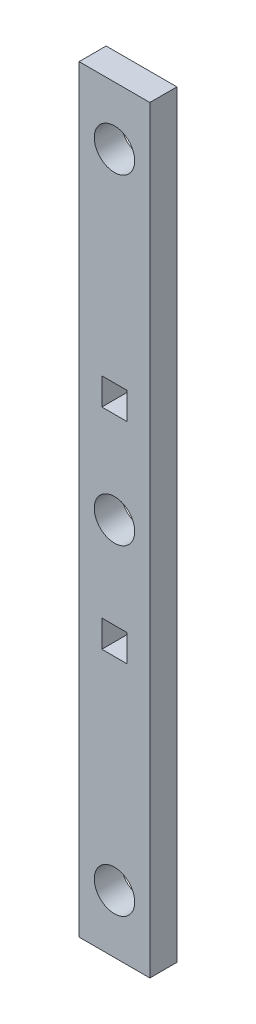
ISO-10303-21;
HEADER;
FILE_DESCRIPTION(('STEP AP214'),'2;1');
FILE_NAME('part.step','',(''),(''),'','','');
FILE_SCHEMA(('AUTOMOTIVE_DESIGN { 1 0 10303 214 1 1 1 1 }'));
ENDSEC;
DATA;
#1=APPLICATION_CONTEXT('core data for automotive mechanical design processes');
#2=APPLICATION_PROTOCOL_DEFINITION('international standard','automotive_design',2000,#1);
#3=PRODUCT_CONTEXT('',#1,'mechanical');
#4=PRODUCT('Part','Part','',(#3));
#5=PRODUCT_RELATED_PRODUCT_CATEGORY('part','',(#4));
#6=PRODUCT_DEFINITION_FORMATION('','',#4);
#7=PRODUCT_DEFINITION_CONTEXT('part definition',#1,'design');
#8=PRODUCT_DEFINITION('design','',#6,#7);
#9=PRODUCT_DEFINITION_SHAPE('','',#8);
#10=(LENGTH_UNIT() NAMED_UNIT(*) SI_UNIT(.MILLI.,.METRE.));
#11=(NAMED_UNIT(*) PLANE_ANGLE_UNIT() SI_UNIT($,.RADIAN.));
#12=(NAMED_UNIT(*) SI_UNIT($,.STERADIAN.) SOLID_ANGLE_UNIT());
#13=UNCERTAINTY_MEASURE_WITH_UNIT(LENGTH_MEASURE(1.E-05),#10,'distance_accuracy_value','');
#14=(GEOMETRIC_REPRESENTATION_CONTEXT(3) GLOBAL_UNCERTAINTY_ASSIGNED_CONTEXT((#13)) GLOBAL_UNIT_ASSIGNED_CONTEXT((#10,
#11,#12)) REPRESENTATION_CONTEXT('',''));
#15=CARTESIAN_POINT('',(0.,0.,0.));
#16=DIRECTION('',(0.,0.,1.));
#17=DIRECTION('',(1.,0.,0.));
#18=AXIS2_PLACEMENT_3D('',#15,#16,#17);
#19=CARTESIAN_POINT('',(0.,0.,5.35));
#20=DIRECTION('',(0.,0.,-1.));
#21=DIRECTION('',(-1.,0.,0.));
#22=AXIS2_PLACEMENT_3D('',#19,#20,#21);
#23=PLANE('',#22);
#24=CARTESIAN_POINT('',(7.,11.5,5.35));
#25=DIRECTION('',(0.,0.,1.));
#26=DIRECTION('',(-1.,0.,0.));
#27=AXIS2_PLACEMENT_3D('',#24,#25,#26);
#28=CIRCLE('',#27,4.);
#29=CARTESIAN_POINT('',(3.,11.5,5.35));
#30=VERTEX_POINT('',#29);
#31=EDGE_CURVE('E157',#30,#30,#28,.T.);
#32=ORIENTED_EDGE('',*,*,#31,.F.);
#33=EDGE_LOOP('',(#32));
#34=FACE_BOUND('',#33,.T.);
#35=DIRECTION('',(0.,1.,0.));
#36=VECTOR('',#35,1.);
#37=CARTESIAN_POINT('',(9.50000000000001,98.425,5.35));
#38=LINE('',#37,#36);
#39=CARTESIAN_POINT('',(9.50000000000001,93.075,5.35));
#40=VERTEX_POINT('',#39);
#41=CARTESIAN_POINT('',(9.50000000000001,98.425,5.35));
#42=VERTEX_POINT('',#41);
#43=EDGE_CURVE('E163',#40,#42,#38,.T.);
#44=ORIENTED_EDGE('',*,*,#43,.F.);
#45=DIRECTION('',(1.,0.,0.));
#46=VECTOR('',#45,1.);
#47=CARTESIAN_POINT('',(4.50000000000001,93.075,5.35));
#48=LINE('',#47,#46);
#49=CARTESIAN_POINT('',(4.50000000000001,93.075,5.35));
#50=VERTEX_POINT('',#49);
#51=EDGE_CURVE('E171',#50,#40,#48,.T.);
#52=ORIENTED_EDGE('',*,*,#51,.F.);
#53=DIRECTION('',(0.,-1.,0.));
#54=VECTOR('',#53,1.);
#55=CARTESIAN_POINT('',(4.50000000000001,98.425,5.35));
#56=LINE('',#55,#54);
#57=CARTESIAN_POINT('',(4.50000000000001,98.425,5.35));
#58=VERTEX_POINT('',#57);
#59=EDGE_CURVE('E168',#58,#50,#56,.T.);
#60=ORIENTED_EDGE('',*,*,#59,.F.);
#61=DIRECTION('',(-1.,0.,0.));
#62=VECTOR('',#61,1.);
#63=CARTESIAN_POINT('',(4.50000000000001,98.425,5.35));
#64=LINE('',#63,#62);
#65=EDGE_CURVE('E165',#42,#58,#64,.T.);
#66=ORIENTED_EDGE('',*,*,#65,.F.);
#67=EDGE_LOOP('',(#44,#52,#60,#66));
#68=FACE_BOUND('',#67,.T.);
#69=DIRECTION('',(0.,-1.,0.));
#70=VECTOR('',#69,1.);
#71=CARTESIAN_POINT('',(0.,0.,5.35));
#72=LINE('',#71,#70);
#73=CARTESIAN_POINT('',(0.,150.,5.35));
#74=VERTEX_POINT('',#73);
#75=CARTESIAN_POINT('',(0.,0.,5.35));
#76=VERTEX_POINT('',#75);
#77=EDGE_CURVE('E206',#74,#76,#72,.T.);
#78=ORIENTED_EDGE('',*,*,#77,.T.);
#79=DIRECTION('',(1.,0.,0.));
#80=VECTOR('',#79,1.);
#81=CARTESIAN_POINT('',(0.,0.,5.35));
#82=LINE('',#81,#80);
#83=CARTESIAN_POINT('',(14.,0.,5.35));
#84=VERTEX_POINT('',#83);
#85=EDGE_CURVE('E209',#76,#84,#82,.T.);
#86=ORIENTED_EDGE('',*,*,#85,.T.);
#87=DIRECTION('',(0.,1.,0.));
#88=VECTOR('',#87,1.);
#89=CARTESIAN_POINT('',(14.,0.,5.35));
#90=LINE('',#89,#88);
#91=CARTESIAN_POINT('',(14.,150.,5.35));
#92=VERTEX_POINT('',#91);
#93=EDGE_CURVE('E212',#84,#92,#90,.T.);
#94=ORIENTED_EDGE('',*,*,#93,.T.);
#95=DIRECTION('',(-1.,0.,0.));
#96=VECTOR('',#95,1.);
#97=CARTESIAN_POINT('',(0.,150.,5.35));
#98=LINE('',#97,#96);
#99=EDGE_CURVE('E214',#92,#74,#98,.T.);
#100=ORIENTED_EDGE('',*,*,#99,.T.);
#101=EDGE_LOOP('',(#78,#86,#94,#100));
#102=FACE_BOUND('',#101,.T.);
#103=CARTESIAN_POINT('',(7.,138.5,5.35));
#104=DIRECTION('',(0.,0.,1.));
#105=DIRECTION('',(1.,0.,0.));
#106=AXIS2_PLACEMENT_3D('',#103,#104,#105);
#107=CIRCLE('',#106,4.);
#108=CARTESIAN_POINT('',(11.,138.5,5.35));
#109=VERTEX_POINT('',#108);
#110=EDGE_CURVE('E200',#109,#109,#107,.T.);
#111=ORIENTED_EDGE('',*,*,#110,.F.);
#112=EDGE_LOOP('',(#111));
#113=FACE_BOUND('',#112,.T.);
#114=CARTESIAN_POINT('',(7.,75.,5.35));
#115=DIRECTION('',(0.,0.,1.));
#116=DIRECTION('',(1.,0.,0.));
#117=AXIS2_PLACEMENT_3D('',#114,#115,#116);
#118=CIRCLE('',#117,4.);
#119=CARTESIAN_POINT('',(11.,75.,5.35));
#120=VERTEX_POINT('',#119);
#121=EDGE_CURVE('E194',#120,#120,#118,.T.);
#122=ORIENTED_EDGE('',*,*,#121,.F.);
#123=EDGE_LOOP('',(#122));
#124=FACE_BOUND('',#123,.T.);
#125=DIRECTION('',(0.,-1.,0.));
#126=VECTOR('',#125,1.);
#127=CARTESIAN_POINT('',(4.50000000000001,51.575,5.35));
#128=LINE('',#127,#126);
#129=CARTESIAN_POINT('',(4.50000000000001,56.925,5.35));
#130=VERTEX_POINT('',#129);
#131=CARTESIAN_POINT('',(4.50000000000001,51.575,5.35));
#132=VERTEX_POINT('',#131);
#133=EDGE_CURVE('E121',#130,#132,#128,.T.);
#134=ORIENTED_EDGE('',*,*,#133,.F.);
#135=DIRECTION('',(-1.,0.,0.));
#136=VECTOR('',#135,1.);
#137=CARTESIAN_POINT('',(4.50000000000001,56.925,5.35));
#138=LINE('',#137,#136);
#139=CARTESIAN_POINT('',(9.50000000000001,56.925,5.35));
#140=VERTEX_POINT('',#139);
#141=EDGE_CURVE('E143',#140,#130,#138,.T.);
#142=ORIENTED_EDGE('',*,*,#141,.F.);
#143=DIRECTION('',(0.,1.,0.));
#144=VECTOR('',#143,1.);
#145=CARTESIAN_POINT('',(9.50000000000001,51.575,5.35));
#146=LINE('',#145,#144);
#147=CARTESIAN_POINT('',(9.50000000000001,51.575,5.35));
#148=VERTEX_POINT('',#147);
#149=EDGE_CURVE('E141',#148,#140,#146,.T.);
#150=ORIENTED_EDGE('',*,*,#149,.F.);
#151=DIRECTION('',(1.,0.,0.));
#152=VECTOR('',#151,1.);
#153=CARTESIAN_POINT('',(4.50000000000001,51.575,5.35));
#154=LINE('',#153,#152);
#155=EDGE_CURVE('E129',#132,#148,#154,.T.);
#156=ORIENTED_EDGE('',*,*,#155,.F.);
#157=EDGE_LOOP('',(#134,#142,#150,#156));
#158=FACE_BOUND('',#157,.T.);
#159=ADVANCED_FACE('F32',(#34,#68,#102,#113,#124,#158),#23,.F.);
#160=CARTESIAN_POINT('',(0.,0.,0.));
#161=DIRECTION('',(0.,0.,-1.));
#162=DIRECTION('',(-1.,0.,0.));
#163=AXIS2_PLACEMENT_3D('',#160,#161,#162);
#164=PLANE('',#163);
#165=DIRECTION('',(1.,0.,0.));
#166=VECTOR('',#165,1.);
#167=CARTESIAN_POINT('',(4.50000000000001,93.075,0.));
#168=LINE('',#167,#166);
#169=CARTESIAN_POINT('',(4.50000000000001,93.075,0.));
#170=VERTEX_POINT('',#169);
#171=CARTESIAN_POINT('',(9.50000000000001,93.075,0.));
#172=VERTEX_POINT('',#171);
#173=EDGE_CURVE('E166',#170,#172,#168,.T.);
#174=ORIENTED_EDGE('',*,*,#173,.T.);
#175=DIRECTION('',(0.,1.,0.));
#176=VECTOR('',#175,1.);
#177=CARTESIAN_POINT('',(9.50000000000001,98.425,0.));
#178=LINE('',#177,#176);
#179=CARTESIAN_POINT('',(9.50000000000001,98.425,0.));
#180=VERTEX_POINT('',#179);
#181=EDGE_CURVE('E160',#172,#180,#178,.T.);
#182=ORIENTED_EDGE('',*,*,#181,.T.);
#183=DIRECTION('',(-1.,0.,0.));
#184=VECTOR('',#183,1.);
#185=CARTESIAN_POINT('',(4.50000000000001,98.425,0.));
#186=LINE('',#185,#184);
#187=CARTESIAN_POINT('',(4.50000000000001,98.425,0.));
#188=VERTEX_POINT('',#187);
#189=EDGE_CURVE('E176',#180,#188,#186,.T.);
#190=ORIENTED_EDGE('',*,*,#189,.T.);
#191=DIRECTION('',(0.,-1.,0.));
#192=VECTOR('',#191,1.);
#193=CARTESIAN_POINT('',(4.50000000000001,98.425,0.));
#194=LINE('',#193,#192);
#195=EDGE_CURVE('E179',#188,#170,#194,.T.);
#196=ORIENTED_EDGE('',*,*,#195,.T.);
#197=EDGE_LOOP('',(#174,#182,#190,#196));
#198=FACE_BOUND('',#197,.T.);
#199=CARTESIAN_POINT('',(7.,75.,0.));
#200=DIRECTION('',(0.,0.,1.));
#201=DIRECTION('',(1.,0.,0.));
#202=AXIS2_PLACEMENT_3D('',#199,#200,#201);
#203=CIRCLE('',#202,4.);
#204=CARTESIAN_POINT('',(11.,75.,0.));
#205=VERTEX_POINT('',#204);
#206=EDGE_CURVE('E193',#205,#205,#203,.T.);
#207=ORIENTED_EDGE('',*,*,#206,.T.);
#208=EDGE_LOOP('',(#207));
#209=FACE_BOUND('',#208,.T.);
#210=DIRECTION('',(0.,-1.,0.));
#211=VECTOR('',#210,1.);
#212=CARTESIAN_POINT('',(0.,0.,0.));
#213=LINE('',#212,#211);
#214=CARTESIAN_POINT('',(0.,150.,0.));
#215=VERTEX_POINT('',#214);
#216=CARTESIAN_POINT('',(0.,0.,0.));
#217=VERTEX_POINT('',#216);
#218=EDGE_CURVE('E203',#215,#217,#213,.T.);
#219=ORIENTED_EDGE('',*,*,#218,.F.);
#220=DIRECTION('',(-1.,0.,0.));
#221=VECTOR('',#220,1.);
#222=CARTESIAN_POINT('',(0.,150.,0.));
#223=LINE('',#222,#221);
#224=CARTESIAN_POINT('',(14.,150.,0.));
#225=VERTEX_POINT('',#224);
#226=EDGE_CURVE('E210',#225,#215,#223,.T.);
#227=ORIENTED_EDGE('',*,*,#226,.F.);
#228=DIRECTION('',(0.,1.,0.));
#229=VECTOR('',#228,1.);
#230=CARTESIAN_POINT('',(14.,0.,0.));
#231=LINE('',#230,#229);
#232=CARTESIAN_POINT('',(14.,0.,0.));
#233=VERTEX_POINT('',#232);
#234=EDGE_CURVE('E221',#233,#225,#231,.T.);
#235=ORIENTED_EDGE('',*,*,#234,.F.);
#236=DIRECTION('',(1.,0.,0.));
#237=VECTOR('',#236,1.);
#238=CARTESIAN_POINT('',(0.,0.,0.));
#239=LINE('',#238,#237);
#240=EDGE_CURVE('E219',#217,#233,#239,.T.);
#241=ORIENTED_EDGE('',*,*,#240,.F.);
#242=EDGE_LOOP('',(#219,#227,#235,#241));
#243=FACE_BOUND('',#242,.T.);
#244=CARTESIAN_POINT('',(7.,138.5,0.));
#245=DIRECTION('',(0.,0.,1.));
#246=DIRECTION('',(1.,0.,0.));
#247=AXIS2_PLACEMENT_3D('',#244,#245,#246);
#248=CIRCLE('',#247,4.);
#249=CARTESIAN_POINT('',(11.,138.5,0.));
#250=VERTEX_POINT('',#249);
#251=EDGE_CURVE('E197',#250,#250,#248,.T.);
#252=ORIENTED_EDGE('',*,*,#251,.T.);
#253=EDGE_LOOP('',(#252));
#254=FACE_BOUND('',#253,.T.);
#255=CARTESIAN_POINT('',(7.,11.5,0.));
#256=DIRECTION('',(0.,0.,1.));
#257=DIRECTION('',(-1.,0.,0.));
#258=AXIS2_PLACEMENT_3D('',#255,#256,#257);
#259=CIRCLE('',#258,4.);
#260=CARTESIAN_POINT('',(3.,11.5,0.));
#261=VERTEX_POINT('',#260);
#262=EDGE_CURVE('E137',#261,#261,#259,.T.);
#263=ORIENTED_EDGE('',*,*,#262,.T.);
#264=EDGE_LOOP('',(#263));
#265=FACE_BOUND('',#264,.T.);
#266=DIRECTION('',(-1.,0.,0.));
#267=VECTOR('',#266,1.);
#268=CARTESIAN_POINT('',(4.50000000000001,56.925,0.));
#269=LINE('',#268,#267);
#270=CARTESIAN_POINT('',(9.50000000000001,56.925,0.));
#271=VERTEX_POINT('',#270);
#272=CARTESIAN_POINT('',(4.50000000000001,56.925,0.));
#273=VERTEX_POINT('',#272);
#274=EDGE_CURVE('E130',#271,#273,#269,.T.);
#275=ORIENTED_EDGE('',*,*,#274,.T.);
#276=DIRECTION('',(0.,-1.,0.));
#277=VECTOR('',#276,1.);
#278=CARTESIAN_POINT('',(4.50000000000001,51.575,0.));
#279=LINE('',#278,#277);
#280=CARTESIAN_POINT('',(4.50000000000001,51.575,0.));
#281=VERTEX_POINT('',#280);
#282=EDGE_CURVE('E55',#273,#281,#279,.T.);
#283=ORIENTED_EDGE('',*,*,#282,.T.);
#284=DIRECTION('',(1.,0.,0.));
#285=VECTOR('',#284,1.);
#286=CARTESIAN_POINT('',(4.50000000000001,51.575,0.));
#287=LINE('',#286,#285);
#288=CARTESIAN_POINT('',(9.50000000000001,51.575,0.));
#289=VERTEX_POINT('',#288);
#290=EDGE_CURVE('E136',#281,#289,#287,.T.);
#291=ORIENTED_EDGE('',*,*,#290,.T.);
#292=DIRECTION('',(0.,1.,0.));
#293=VECTOR('',#292,1.);
#294=CARTESIAN_POINT('',(9.50000000000001,51.575,0.));
#295=LINE('',#294,#293);
#296=EDGE_CURVE('E149',#289,#271,#295,.T.);
#297=ORIENTED_EDGE('',*,*,#296,.T.);
#298=EDGE_LOOP('',(#275,#283,#291,#297));
#299=FACE_BOUND('',#298,.T.);
#300=ADVANCED_FACE('F239',(#198,#209,#243,#254,#265,#299),#164,.T.);
#301=CARTESIAN_POINT('',(0.,0.,5.35));
#302=DIRECTION('',(1.,0.,0.));
#303=DIRECTION('',(0.,0.,-1.));
#304=AXIS2_PLACEMENT_3D('',#301,#302,#303);
#305=PLANE('',#304);
#306=ORIENTED_EDGE('',*,*,#218,.T.);
#307=DIRECTION('',(0.,0.,-1.));
#308=VECTOR('',#307,1.);
#309=CARTESIAN_POINT('',(0.,0.,5.35));
#310=LINE('',#309,#308);
#311=EDGE_CURVE('E11',#76,#217,#310,.T.);
#312=ORIENTED_EDGE('',*,*,#311,.F.);
#313=ORIENTED_EDGE('',*,*,#77,.F.);
#314=DIRECTION('',(0.,0.,-1.));
#315=VECTOR('',#314,1.);
#316=CARTESIAN_POINT('',(0.,150.,5.35));
#317=LINE('',#316,#315);
#318=EDGE_CURVE('E216',#74,#215,#317,.T.);
#319=ORIENTED_EDGE('',*,*,#318,.T.);
#320=EDGE_LOOP('',(#306,#312,#313,#319));
#321=FACE_BOUND('',#320,.T.);
#322=ADVANCED_FACE('F34',(#321),#305,.F.);
#323=CARTESIAN_POINT('',(0.,0.,5.35));
#324=DIRECTION('',(0.,1.,0.));
#325=DIRECTION('',(0.,0.,1.));
#326=AXIS2_PLACEMENT_3D('',#323,#324,#325);
#327=PLANE('',#326);
#328=ORIENTED_EDGE('',*,*,#240,.T.);
#329=DIRECTION('',(0.,0.,-1.));
#330=VECTOR('',#329,1.);
#331=CARTESIAN_POINT('',(14.,0.,5.35));
#332=LINE('',#331,#330);
#333=EDGE_CURVE('E40',#84,#233,#332,.T.);
#334=ORIENTED_EDGE('',*,*,#333,.F.);
#335=ORIENTED_EDGE('',*,*,#85,.F.);
#336=ORIENTED_EDGE('',*,*,#311,.T.);
#337=EDGE_LOOP('',(#328,#334,#335,#336));
#338=FACE_BOUND('',#337,.T.);
#339=ADVANCED_FACE('F250',(#338),#327,.F.);
#340=CARTESIAN_POINT('',(14.,0.,5.35));
#341=DIRECTION('',(-1.,0.,0.));
#342=DIRECTION('',(0.,0.,1.));
#343=AXIS2_PLACEMENT_3D('',#340,#341,#342);
#344=PLANE('',#343);
#345=ORIENTED_EDGE('',*,*,#234,.T.);
#346=DIRECTION('',(0.,0.,-1.));
#347=VECTOR('',#346,1.);
#348=CARTESIAN_POINT('',(14.,150.,5.35));
#349=LINE('',#348,#347);
#350=EDGE_CURVE('E226',#92,#225,#349,.T.);
#351=ORIENTED_EDGE('',*,*,#350,.F.);
#352=ORIENTED_EDGE('',*,*,#93,.F.);
#353=ORIENTED_EDGE('',*,*,#333,.T.);
#354=EDGE_LOOP('',(#345,#351,#352,#353));
#355=FACE_BOUND('',#354,.T.);
#356=ADVANCED_FACE('F233',(#355),#344,.F.);
#357=CARTESIAN_POINT('',(0.,150.,5.35));
#358=DIRECTION('',(0.,-1.,0.));
#359=DIRECTION('',(0.,0.,-1.));
#360=AXIS2_PLACEMENT_3D('',#357,#358,#359);
#361=PLANE('',#360);
#362=ORIENTED_EDGE('',*,*,#226,.T.);
#363=ORIENTED_EDGE('',*,*,#318,.F.);
#364=ORIENTED_EDGE('',*,*,#99,.F.);
#365=ORIENTED_EDGE('',*,*,#350,.T.);
#366=EDGE_LOOP('',(#362,#363,#364,#365));
#367=FACE_BOUND('',#366,.T.);
#368=ADVANCED_FACE('F243',(#367),#361,.F.);
#369=CARTESIAN_POINT('',(7.,138.5,5.35));
#370=DIRECTION('',(0.,0.,-1.));
#371=DIRECTION('',(-1.,0.,0.));
#372=AXIS2_PLACEMENT_3D('',#369,#370,#371);
#373=CYLINDRICAL_SURFACE('',#372,4.);
#374=ORIENTED_EDGE('',*,*,#110,.T.);
#375=EDGE_LOOP('',(#374));
#376=FACE_BOUND('',#375,.T.);
#377=ORIENTED_EDGE('',*,*,#251,.F.);
#378=EDGE_LOOP('',(#377));
#379=FACE_BOUND('',#378,.T.);
#380=ADVANCED_FACE('F268',(#376,#379),#373,.F.);
#381=CARTESIAN_POINT('',(7.,75.,5.35));
#382=DIRECTION('',(0.,0.,-1.));
#383=DIRECTION('',(-1.,0.,0.));
#384=AXIS2_PLACEMENT_3D('',#381,#382,#383);
#385=CYLINDRICAL_SURFACE('',#384,4.);
#386=ORIENTED_EDGE('',*,*,#121,.T.);
#387=EDGE_LOOP('',(#386));
#388=FACE_BOUND('',#387,.T.);
#389=ORIENTED_EDGE('',*,*,#206,.F.);
#390=EDGE_LOOP('',(#389));
#391=FACE_BOUND('',#390,.T.);
#392=ADVANCED_FACE('F275',(#388,#391),#385,.F.);
#393=CARTESIAN_POINT('',(9.50000000000001,98.425,5.35));
#394=DIRECTION('',(-1.,0.,0.));
#395=DIRECTION('',(0.,-1.,0.));
#396=AXIS2_PLACEMENT_3D('',#393,#394,#395);
#397=PLANE('',#396);
#398=ORIENTED_EDGE('',*,*,#181,.F.);
#399=DIRECTION('',(0.,0.,-1.));
#400=VECTOR('',#399,1.);
#401=CARTESIAN_POINT('',(9.50000000000001,93.075,5.35));
#402=LINE('',#401,#400);
#403=EDGE_CURVE('E173',#40,#172,#402,.T.);
#404=ORIENTED_EDGE('',*,*,#403,.F.);
#405=ORIENTED_EDGE('',*,*,#43,.T.);
#406=DIRECTION('',(0.,0.,-1.));
#407=VECTOR('',#406,1.);
#408=CARTESIAN_POINT('',(9.50000000000001,98.425,5.35));
#409=LINE('',#408,#407);
#410=EDGE_CURVE('E190',#42,#180,#409,.T.);
#411=ORIENTED_EDGE('',*,*,#410,.T.);
#412=EDGE_LOOP('',(#398,#404,#405,#411));
#413=FACE_BOUND('',#412,.T.);
#414=ADVANCED_FACE('F280',(#413),#397,.T.);
#415=CARTESIAN_POINT('',(4.50000000000001,98.425,5.35));
#416=DIRECTION('',(0.,-1.,0.));
#417=DIRECTION('',(0.,0.,-1.));
#418=AXIS2_PLACEMENT_3D('',#415,#416,#417);
#419=PLANE('',#418);
#420=ORIENTED_EDGE('',*,*,#189,.F.);
#421=ORIENTED_EDGE('',*,*,#410,.F.);
#422=ORIENTED_EDGE('',*,*,#65,.T.);
#423=DIRECTION('',(0.,0.,-1.));
#424=VECTOR('',#423,1.);
#425=CARTESIAN_POINT('',(4.50000000000001,98.425,5.35));
#426=LINE('',#425,#424);
#427=EDGE_CURVE('E188',#58,#188,#426,.T.);
#428=ORIENTED_EDGE('',*,*,#427,.T.);
#429=EDGE_LOOP('',(#420,#421,#422,#428));
#430=FACE_BOUND('',#429,.T.);
#431=ADVANCED_FACE('F314',(#430),#419,.T.);
#432=CARTESIAN_POINT('',(4.50000000000001,98.425,5.35));
#433=DIRECTION('',(1.,0.,0.));
#434=DIRECTION('',(0.,1.,0.));
#435=AXIS2_PLACEMENT_3D('',#432,#433,#434);
#436=PLANE('',#435);
#437=ORIENTED_EDGE('',*,*,#195,.F.);
#438=ORIENTED_EDGE('',*,*,#427,.F.);
#439=ORIENTED_EDGE('',*,*,#59,.T.);
#440=DIRECTION('',(0.,0.,-1.));
#441=VECTOR('',#440,1.);
#442=CARTESIAN_POINT('',(4.50000000000001,93.075,5.35));
#443=LINE('',#442,#441);
#444=EDGE_CURVE('E186',#50,#170,#443,.T.);
#445=ORIENTED_EDGE('',*,*,#444,.T.);
#446=EDGE_LOOP('',(#437,#438,#439,#445));
#447=FACE_BOUND('',#446,.T.);
#448=ADVANCED_FACE('F310',(#447),#436,.T.);
#449=CARTESIAN_POINT('',(4.50000000000001,93.075,5.35));
#450=DIRECTION('',(0.,1.,0.));
#451=DIRECTION('',(0.,0.,1.));
#452=AXIS2_PLACEMENT_3D('',#449,#450,#451);
#453=PLANE('',#452);
#454=ORIENTED_EDGE('',*,*,#173,.F.);
#455=ORIENTED_EDGE('',*,*,#444,.F.);
#456=ORIENTED_EDGE('',*,*,#51,.T.);
#457=ORIENTED_EDGE('',*,*,#403,.T.);
#458=EDGE_LOOP('',(#454,#455,#456,#457));
#459=FACE_BOUND('',#458,.T.);
#460=ADVANCED_FACE('F306',(#459),#453,.T.);
#461=CARTESIAN_POINT('',(7.,11.5,5.35));
#462=DIRECTION('',(0.,0.,-1.));
#463=DIRECTION('',(-1.,0.,0.));
#464=AXIS2_PLACEMENT_3D('',#461,#462,#463);
#465=CYLINDRICAL_SURFACE('',#464,4.);
#466=ORIENTED_EDGE('',*,*,#31,.T.);
#467=EDGE_LOOP('',(#466));
#468=FACE_BOUND('',#467,.T.);
#469=ORIENTED_EDGE('',*,*,#262,.F.);
#470=EDGE_LOOP('',(#469));
#471=FACE_BOUND('',#470,.T.);
#472=ADVANCED_FACE('F303',(#468,#471),#465,.F.);
#473=CARTESIAN_POINT('',(4.50000000000001,51.575,5.35));
#474=DIRECTION('',(1.,0.,0.));
#475=DIRECTION('',(0.,1.,0.));
#476=AXIS2_PLACEMENT_3D('',#473,#474,#475);
#477=PLANE('',#476);
#478=ORIENTED_EDGE('',*,*,#282,.F.);
#479=DIRECTION('',(0.,0.,-1.));
#480=VECTOR('',#479,1.);
#481=CARTESIAN_POINT('',(4.50000000000001,56.925,5.35));
#482=LINE('',#481,#480);
#483=EDGE_CURVE('E125',#130,#273,#482,.T.);
#484=ORIENTED_EDGE('',*,*,#483,.F.);
#485=ORIENTED_EDGE('',*,*,#133,.T.);
#486=DIRECTION('',(0.,0.,-1.));
#487=VECTOR('',#486,1.);
#488=CARTESIAN_POINT('',(4.50000000000001,51.575,5.35));
#489=LINE('',#488,#487);
#490=EDGE_CURVE('E124',#132,#281,#489,.T.);
#491=ORIENTED_EDGE('',*,*,#490,.T.);
#492=EDGE_LOOP('',(#478,#484,#485,#491));
#493=FACE_BOUND('',#492,.T.);
#494=ADVANCED_FACE('F123',(#493),#477,.T.);
#495=CARTESIAN_POINT('',(4.50000000000001,51.575,5.35));
#496=DIRECTION('',(0.,1.,0.));
#497=DIRECTION('',(0.,0.,1.));
#498=AXIS2_PLACEMENT_3D('',#495,#496,#497);
#499=PLANE('',#498);
#500=ORIENTED_EDGE('',*,*,#290,.F.);
#501=ORIENTED_EDGE('',*,*,#490,.F.);
#502=ORIENTED_EDGE('',*,*,#155,.T.);
#503=DIRECTION('',(0.,0.,-1.));
#504=VECTOR('',#503,1.);
#505=CARTESIAN_POINT('',(9.50000000000001,51.575,5.35));
#506=LINE('',#505,#504);
#507=EDGE_CURVE('E138',#148,#289,#506,.T.);
#508=ORIENTED_EDGE('',*,*,#507,.T.);
#509=EDGE_LOOP('',(#500,#501,#502,#508));
#510=FACE_BOUND('',#509,.T.);
#511=ADVANCED_FACE('F133',(#510),#499,.T.);
#512=CARTESIAN_POINT('',(9.50000000000001,51.575,5.35));
#513=DIRECTION('',(-1.,0.,0.));
#514=DIRECTION('',(0.,-1.,0.));
#515=AXIS2_PLACEMENT_3D('',#512,#513,#514);
#516=PLANE('',#515);
#517=ORIENTED_EDGE('',*,*,#296,.F.);
#518=ORIENTED_EDGE('',*,*,#507,.F.);
#519=ORIENTED_EDGE('',*,*,#149,.T.);
#520=DIRECTION('',(0.,0.,-1.));
#521=VECTOR('',#520,1.);
#522=CARTESIAN_POINT('',(9.50000000000001,56.925,5.35));
#523=LINE('',#522,#521);
#524=EDGE_CURVE('E47',#140,#271,#523,.T.);
#525=ORIENTED_EDGE('',*,*,#524,.T.);
#526=EDGE_LOOP('',(#517,#518,#519,#525));
#527=FACE_BOUND('',#526,.T.);
#528=ADVANCED_FACE('F291',(#527),#516,.T.);
#529=CARTESIAN_POINT('',(4.50000000000001,56.925,5.35));
#530=DIRECTION('',(0.,-1.,0.));
#531=DIRECTION('',(0.,0.,-1.));
#532=AXIS2_PLACEMENT_3D('',#529,#530,#531);
#533=PLANE('',#532);
#534=ORIENTED_EDGE('',*,*,#274,.F.);
#535=ORIENTED_EDGE('',*,*,#524,.F.);
#536=ORIENTED_EDGE('',*,*,#141,.T.);
#537=ORIENTED_EDGE('',*,*,#483,.T.);
#538=EDGE_LOOP('',(#534,#535,#536,#537));
#539=FACE_BOUND('',#538,.T.);
#540=ADVANCED_FACE('F289',(#539),#533,.T.);
#541=CLOSED_SHELL('',(#159,#300,#322,#339,#356,#368,#380,#392,#414,#431,#448,#460,#472,#494,
#511,#528,#540));
#542=MANIFOLD_SOLID_BREP('B2',#541);
#543=ADVANCED_BREP_SHAPE_REPRESENTATION('',(#18,#542),#14);
#544=SHAPE_DEFINITION_REPRESENTATION(#9,#543);
ENDSEC;
END-ISO-10303-21;
